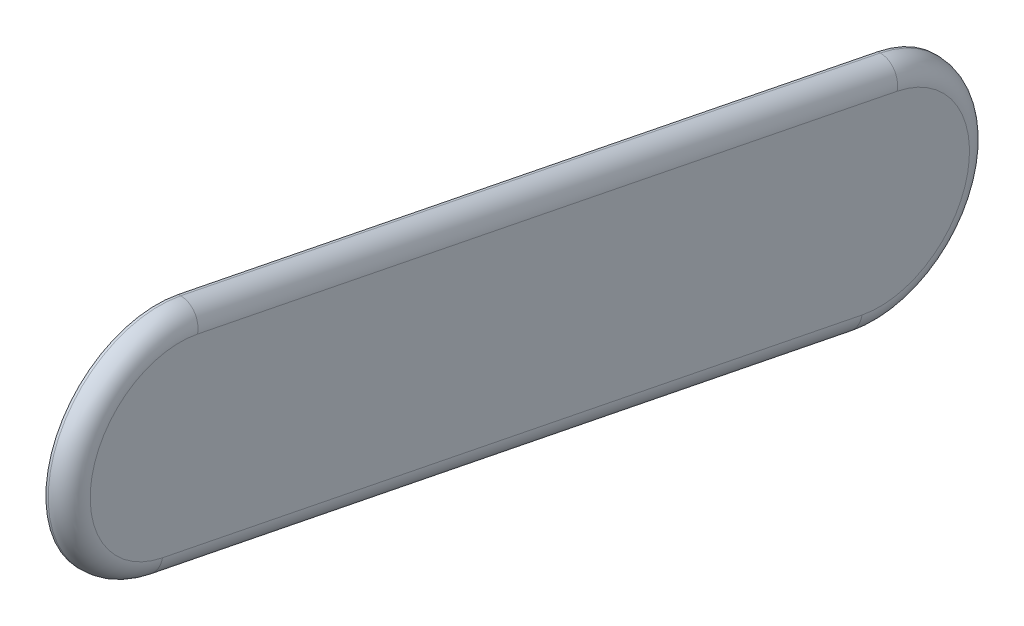
ISO-10303-21;
HEADER;
FILE_DESCRIPTION(('STEP AP214'),'2;1');
FILE_NAME('part.step','',(''),(''),'','','');
FILE_SCHEMA(('AUTOMOTIVE_DESIGN { 1 0 10303 214 1 1 1 1 }'));
ENDSEC;
DATA;
#1=APPLICATION_CONTEXT('core data for automotive mechanical design processes');
#2=APPLICATION_PROTOCOL_DEFINITION('international standard','automotive_design',2000,#1);
#3=PRODUCT_CONTEXT('',#1,'mechanical');
#4=PRODUCT('Part','Part','',(#3));
#5=PRODUCT_RELATED_PRODUCT_CATEGORY('part','',(#4));
#6=PRODUCT_DEFINITION_FORMATION('','',#4);
#7=PRODUCT_DEFINITION_CONTEXT('part definition',#1,'design');
#8=PRODUCT_DEFINITION('design','',#6,#7);
#9=PRODUCT_DEFINITION_SHAPE('','',#8);
#10=(LENGTH_UNIT() NAMED_UNIT(*) SI_UNIT(.MILLI.,.METRE.));
#11=(NAMED_UNIT(*) PLANE_ANGLE_UNIT() SI_UNIT($,.RADIAN.));
#12=(NAMED_UNIT(*) SI_UNIT($,.STERADIAN.) SOLID_ANGLE_UNIT());
#13=UNCERTAINTY_MEASURE_WITH_UNIT(LENGTH_MEASURE(1.E-05),#10,'distance_accuracy_value','');
#14=(GEOMETRIC_REPRESENTATION_CONTEXT(3) GLOBAL_UNCERTAINTY_ASSIGNED_CONTEXT((#13)) GLOBAL_UNIT_ASSIGNED_CONTEXT((#10,
#11,#12)) REPRESENTATION_CONTEXT('',''));
#15=CARTESIAN_POINT('',(0.,0.,0.));
#16=DIRECTION('',(0.,0.,1.));
#17=DIRECTION('',(1.,0.,0.));
#18=AXIS2_PLACEMENT_3D('',#15,#16,#17);
#19=CARTESIAN_POINT('',(2.54,59.6610574188244,104.155047564119));
#20=DIRECTION('',(-1.,0.,0.));
#21=DIRECTION('',(0.,0.,1.));
#22=AXIS2_PLACEMENT_3D('',#19,#20,#21);
#23=CYLINDRICAL_SURFACE('',#22,12.072260744014);
#24=DIRECTION('',(-1.,0.,0.));
#25=VECTOR('',#24,1.);
#26=CARTESIAN_POINT('',(2.54,47.821935133557,106.51611998697));
#27=LINE('',#26,#25);
#28=CARTESIAN_POINT('',(0.254,47.821935133557,106.51611998697));
#29=VERTEX_POINT('',#28);
#30=CARTESIAN_POINT('',(0.,47.821935133557,106.51611998697));
#31=VERTEX_POINT('',#30);
#32=EDGE_CURVE('E92',#29,#31,#27,.T.);
#33=ORIENTED_EDGE('',*,*,#32,.F.);
#34=CARTESIAN_POINT('',(0.254,59.6610574188244,104.155047564119));
#35=DIRECTION('',(1.,0.,0.));
#36=DIRECTION('',(0.,0.,-1.));
#37=AXIS2_PLACEMENT_3D('',#34,#35,#36);
#38=CIRCLE('',#37,12.072260744014);
#39=CARTESIAN_POINT('',(0.254,71.5001797040918,101.793975141268));
#40=VERTEX_POINT('',#39);
#41=EDGE_CURVE('E11',#29,#40,#38,.F.);
#42=ORIENTED_EDGE('',*,*,#41,.T.);
#43=DIRECTION('',(-1.,0.,0.));
#44=VECTOR('',#43,1.);
#45=CARTESIAN_POINT('',(2.54,71.5001797040918,101.793975141268));
#46=LINE('',#45,#44);
#47=CARTESIAN_POINT('',(0.,71.5001797040918,101.793975141268));
#48=VERTEX_POINT('',#47);
#49=EDGE_CURVE('E114',#40,#48,#46,.T.);
#50=ORIENTED_EDGE('',*,*,#49,.T.);
#51=CARTESIAN_POINT('',(0.,59.6610574188244,104.155047564119));
#52=DIRECTION('',(1.,0.,0.));
#53=DIRECTION('',(0.,0.,-1.));
#54=AXIS2_PLACEMENT_3D('',#51,#52,#53);
#55=CIRCLE('',#54,12.072260744014);
#56=EDGE_CURVE('E108',#48,#31,#55,.T.);
#57=ORIENTED_EDGE('',*,*,#56,.T.);
#58=EDGE_LOOP('',(#33,#42,#50,#57));
#59=FACE_BOUND('',#58,.T.);
#60=ADVANCED_FACE('F39',(#59),#23,.T.);
#61=CARTESIAN_POINT('',(2.54,47.821935133557,106.51611998697));
#62=DIRECTION('',(0.,0.980688086209353,-0.195578315687185));
#63=DIRECTION('',(0.,0.195578315687185,0.980688086209353));
#64=AXIS2_PLACEMENT_3D('',#61,#62,#63);
#65=PLANE('',#64);
#66=DIRECTION('',(-1.,0.,0.));
#67=VECTOR('',#66,1.);
#68=CARTESIAN_POINT('',(2.54,32.625393169875,30.3161199869696));
#69=LINE('',#68,#67);
#70=CARTESIAN_POINT('',(0.254,32.625393169875,30.3161199869696));
#71=VERTEX_POINT('',#70);
#72=CARTESIAN_POINT('',(0.,32.625393169875,30.3161199869696));
#73=VERTEX_POINT('',#72);
#74=EDGE_CURVE('E102',#71,#73,#69,.T.);
#75=ORIENTED_EDGE('',*,*,#74,.F.);
#76=DIRECTION('',(0.,-0.195578315687185,-0.980688086209353));
#77=VECTOR('',#76,1.);
#78=CARTESIAN_POINT('',(0.254,47.821935133557,106.51611998697));
#79=LINE('',#78,#77);
#80=EDGE_CURVE('E49',#71,#29,#79,.F.);
#81=ORIENTED_EDGE('',*,*,#80,.T.);
#82=ORIENTED_EDGE('',*,*,#32,.T.);
#83=DIRECTION('',(0.,-0.195578315687185,-0.980688086209353));
#84=VECTOR('',#83,1.);
#85=CARTESIAN_POINT('',(0.,47.821935133557,106.51611998697));
#86=LINE('',#85,#84);
#87=EDGE_CURVE('E95',#31,#73,#86,.T.);
#88=ORIENTED_EDGE('',*,*,#87,.T.);
#89=EDGE_LOOP('',(#75,#81,#82,#88));
#90=FACE_BOUND('',#89,.T.);
#91=ADVANCED_FACE('F94',(#90),#65,.F.);
#92=CARTESIAN_POINT('',(2.54,44.4645154551424,27.9550475641188));
#93=DIRECTION('',(-1.,0.,0.));
#94=DIRECTION('',(0.,0.,1.));
#95=AXIS2_PLACEMENT_3D('',#92,#93,#94);
#96=CYLINDRICAL_SURFACE('',#95,12.072260744014);
#97=DIRECTION('',(-1.,0.,0.));
#98=VECTOR('',#97,1.);
#99=CARTESIAN_POINT('',(2.54,56.3036377404098,25.593975141268));
#100=LINE('',#99,#98);
#101=CARTESIAN_POINT('',(0.254,56.3036377404098,25.593975141268));
#102=VERTEX_POINT('',#101);
#103=CARTESIAN_POINT('',(0.,56.3036377404098,25.593975141268));
#104=VERTEX_POINT('',#103);
#105=EDGE_CURVE('E129',#102,#104,#100,.T.);
#106=ORIENTED_EDGE('',*,*,#105,.F.);
#107=CARTESIAN_POINT('',(0.254,44.4645154551424,27.9550475641188));
#108=DIRECTION('',(1.,0.,0.));
#109=DIRECTION('',(0.,0.,-1.));
#110=AXIS2_PLACEMENT_3D('',#107,#108,#109);
#111=CIRCLE('',#110,12.072260744014);
#112=EDGE_CURVE('E64',#102,#71,#111,.F.);
#113=ORIENTED_EDGE('',*,*,#112,.T.);
#114=ORIENTED_EDGE('',*,*,#74,.T.);
#115=CARTESIAN_POINT('',(0.,44.4645154551424,27.9550475641188));
#116=DIRECTION('',(1.,0.,0.));
#117=DIRECTION('',(0.,0.,-1.));
#118=AXIS2_PLACEMENT_3D('',#115,#116,#117);
#119=CIRCLE('',#118,12.072260744014);
#120=EDGE_CURVE('E110',#73,#104,#119,.T.);
#121=ORIENTED_EDGE('',*,*,#120,.T.);
#122=EDGE_LOOP('',(#106,#113,#114,#121));
#123=FACE_BOUND('',#122,.T.);
#124=ADVANCED_FACE('F179',(#123),#96,.T.);
#125=CARTESIAN_POINT('',(2.54,71.5001797040918,101.793975141268));
#126=DIRECTION('',(0.,-0.980688086209353,0.195578315687185));
#127=DIRECTION('',(0.,-0.195578315687185,-0.980688086209353));
#128=AXIS2_PLACEMENT_3D('',#125,#126,#127);
#129=PLANE('',#128);
#130=ORIENTED_EDGE('',*,*,#49,.F.);
#131=DIRECTION('',(0.,0.195578315687185,0.980688086209353));
#132=VECTOR('',#131,1.);
#133=CARTESIAN_POINT('',(0.254,56.3036377404098,25.593975141268));
#134=LINE('',#133,#132);
#135=EDGE_CURVE('E146',#40,#102,#134,.F.);
#136=ORIENTED_EDGE('',*,*,#135,.T.);
#137=ORIENTED_EDGE('',*,*,#105,.T.);
#138=DIRECTION('',(0.,0.195578315687185,0.980688086209353));
#139=VECTOR('',#138,1.);
#140=CARTESIAN_POINT('',(0.,71.5001797040918,101.793975141268));
#141=LINE('',#140,#139);
#142=EDGE_CURVE('E124',#104,#48,#141,.T.);
#143=ORIENTED_EDGE('',*,*,#142,.T.);
#144=EDGE_LOOP('',(#130,#136,#137,#143));
#145=FACE_BOUND('',#144,.T.);
#146=ADVANCED_FACE('F178',(#145),#129,.F.);
#147=CARTESIAN_POINT('',(2.54,59.6610574188244,104.155047564119));
#148=DIRECTION('',(1.,0.,0.));
#149=DIRECTION('',(0.,0.,-1.));
#150=AXIS2_PLACEMENT_3D('',#147,#148,#149);
#151=PLANE('',#150);
#152=CARTESIAN_POINT('',(2.54,44.4645154551424,27.9550475641188));
#153=DIRECTION('',(1.,0.,0.));
#154=DIRECTION('',(0.,0.,-1.));
#155=AXIS2_PLACEMENT_3D('',#152,#153,#154);
#156=CIRCLE('',#155,9.78626074401402);
#157=CARTESIAN_POINT('',(2.54,34.8672461349495,29.8690279573087));
#158=VERTEX_POINT('',#157);
#159=CARTESIAN_POINT('',(2.54,54.0617847753352,26.0410671709289));
#160=VERTEX_POINT('',#159);
#161=EDGE_CURVE('E139',#158,#160,#156,.T.);
#162=ORIENTED_EDGE('',*,*,#161,.T.);
#163=DIRECTION('',(0.,0.195578315687185,0.980688086209353));
#164=VECTOR('',#163,1.);
#165=CARTESIAN_POINT('',(2.54,69.2583267390173,102.241067170929));
#166=LINE('',#165,#164);
#167=CARTESIAN_POINT('',(2.54,69.2583267390173,102.241067170929));
#168=VERTEX_POINT('',#167);
#169=EDGE_CURVE('E142',#160,#168,#166,.T.);
#170=ORIENTED_EDGE('',*,*,#169,.T.);
#171=CARTESIAN_POINT('',(2.54,59.6610574188244,104.155047564119));
#172=DIRECTION('',(1.,0.,0.));
#173=DIRECTION('',(0.,0.,-1.));
#174=AXIS2_PLACEMENT_3D('',#171,#172,#173);
#175=CIRCLE('',#174,9.78626074401402);
#176=CARTESIAN_POINT('',(2.54,50.0637880986316,106.069027957309));
#177=VERTEX_POINT('',#176);
#178=EDGE_CURVE('E101',#168,#177,#175,.T.);
#179=ORIENTED_EDGE('',*,*,#178,.T.);
#180=DIRECTION('',(0.,-0.195578315687185,-0.980688086209353));
#181=VECTOR('',#180,1.);
#182=CARTESIAN_POINT('',(2.54,34.8672461349495,29.8690279573087));
#183=LINE('',#182,#181);
#184=EDGE_CURVE('E136',#177,#158,#183,.T.);
#185=ORIENTED_EDGE('',*,*,#184,.T.);
#186=EDGE_LOOP('',(#162,#170,#179,#185));
#187=FACE_BOUND('',#186,.T.);
#188=ADVANCED_FACE('F171',(#187),#151,.T.);
#189=CARTESIAN_POINT('',(0.,59.6610574188244,104.155047564119));
#190=DIRECTION('',(1.,0.,0.));
#191=DIRECTION('',(0.,0.,-1.));
#192=AXIS2_PLACEMENT_3D('',#189,#190,#191);
#193=PLANE('',#192);
#194=ORIENTED_EDGE('',*,*,#56,.F.);
#195=ORIENTED_EDGE('',*,*,#142,.F.);
#196=ORIENTED_EDGE('',*,*,#120,.F.);
#197=ORIENTED_EDGE('',*,*,#87,.F.);
#198=EDGE_LOOP('',(#194,#195,#196,#197));
#199=FACE_BOUND('',#198,.T.);
#200=ADVANCED_FACE('F106',(#199),#193,.F.);
#201=CARTESIAN_POINT('',(0.254,50.0637880986316,106.069027957309));
#202=DIRECTION('',(0.,0.195578315687185,0.980688086209353));
#203=DIRECTION('',(0.,-0.980688086209353,0.195578315687185));
#204=AXIS2_PLACEMENT_3D('',#201,#202,#203);
#205=CYLINDRICAL_SURFACE('',#204,2.286);
#206=CARTESIAN_POINT('',(0.254,50.0637880986316,106.069027957309));
#207=DIRECTION('',(0.,0.195578315687187,0.980688086209353));
#208=DIRECTION('',(0.,-0.980688086209353,0.195578315687187));
#209=AXIS2_PLACEMENT_3D('',#206,#207,#208);
#210=CIRCLE('',#209,2.286);
#211=EDGE_CURVE('E120',#29,#177,#210,.T.);
#212=ORIENTED_EDGE('',*,*,#211,.F.);
#213=ORIENTED_EDGE('',*,*,#80,.F.);
#214=CARTESIAN_POINT('',(0.254,34.8672461349495,29.8690279573087));
#215=DIRECTION('',(0.,-0.195578315687185,-0.980688086209353));
#216=DIRECTION('',(0.,0.980688086209353,-0.195578315687185));
#217=AXIS2_PLACEMENT_3D('',#214,#215,#216);
#218=CIRCLE('',#217,2.286);
#219=EDGE_CURVE('E43',#158,#71,#218,.T.);
#220=ORIENTED_EDGE('',*,*,#219,.F.);
#221=ORIENTED_EDGE('',*,*,#184,.F.);
#222=EDGE_LOOP('',(#212,#213,#220,#221));
#223=FACE_BOUND('',#222,.T.);
#224=ADVANCED_FACE('F41',(#223),#205,.T.);
#225=CARTESIAN_POINT('',(0.254,44.4645154551424,27.9550475641188));
#226=DIRECTION('',(1.,0.,0.));
#227=DIRECTION('',(0.,0.,-1.));
#228=AXIS2_PLACEMENT_3D('',#225,#226,#227);
#229=TOROIDAL_SURFACE('',#228,9.78626074401402,2.286);
#230=ORIENTED_EDGE('',*,*,#219,.T.);
#231=ORIENTED_EDGE('',*,*,#112,.F.);
#232=CARTESIAN_POINT('',(0.254,54.0617847753352,26.0410671709289));
#233=DIRECTION('',(0.,0.195578315687185,0.980688086209353));
#234=DIRECTION('',(0.,-0.980688086209353,0.195578315687185));
#235=AXIS2_PLACEMENT_3D('',#232,#233,#234);
#236=CIRCLE('',#235,2.286);
#237=EDGE_CURVE('E157',#160,#102,#236,.T.);
#238=ORIENTED_EDGE('',*,*,#237,.F.);
#239=ORIENTED_EDGE('',*,*,#161,.F.);
#240=EDGE_LOOP('',(#230,#231,#238,#239));
#241=FACE_BOUND('',#240,.T.);
#242=ADVANCED_FACE('F196',(#241),#229,.T.);
#243=CARTESIAN_POINT('',(0.254,59.6610574188244,104.155047564119));
#244=DIRECTION('',(1.,0.,0.));
#245=DIRECTION('',(0.,0.,-1.));
#246=AXIS2_PLACEMENT_3D('',#243,#244,#245);
#247=TOROIDAL_SURFACE('',#246,9.78626074401402,2.286);
#248=ORIENTED_EDGE('',*,*,#211,.T.);
#249=ORIENTED_EDGE('',*,*,#178,.F.);
#250=CARTESIAN_POINT('',(0.254,69.2583267390173,102.241067170929));
#251=DIRECTION('',(0.,-0.195578315687187,-0.980688086209353));
#252=DIRECTION('',(0.,0.980688086209353,-0.195578315687187));
#253=AXIS2_PLACEMENT_3D('',#250,#251,#252);
#254=CIRCLE('',#253,2.286);
#255=EDGE_CURVE('E154',#40,#168,#254,.T.);
#256=ORIENTED_EDGE('',*,*,#255,.F.);
#257=ORIENTED_EDGE('',*,*,#41,.F.);
#258=EDGE_LOOP('',(#248,#249,#256,#257));
#259=FACE_BOUND('',#258,.T.);
#260=ADVANCED_FACE('F164',(#259),#247,.T.);
#261=CARTESIAN_POINT('',(0.254,69.2583267390173,102.241067170929));
#262=DIRECTION('',(0.,-0.195578315687185,-0.980688086209353));
#263=DIRECTION('',(0.,0.980688086209353,-0.195578315687185));
#264=AXIS2_PLACEMENT_3D('',#261,#262,#263);
#265=CYLINDRICAL_SURFACE('',#264,2.286);
#266=ORIENTED_EDGE('',*,*,#237,.T.);
#267=ORIENTED_EDGE('',*,*,#135,.F.);
#268=ORIENTED_EDGE('',*,*,#255,.T.);
#269=ORIENTED_EDGE('',*,*,#169,.F.);
#270=EDGE_LOOP('',(#266,#267,#268,#269));
#271=FACE_BOUND('',#270,.T.);
#272=ADVANCED_FACE('F175',(#271),#265,.T.);
#273=CLOSED_SHELL('',(#60,#91,#124,#146,#188,#200,#224,#242,#260,#272));
#274=MANIFOLD_SOLID_BREP('B2',#273);
#275=ADVANCED_BREP_SHAPE_REPRESENTATION('',(#18,#274),#14);
#276=SHAPE_DEFINITION_REPRESENTATION(#9,#275);
ENDSEC;
END-ISO-10303-21;
